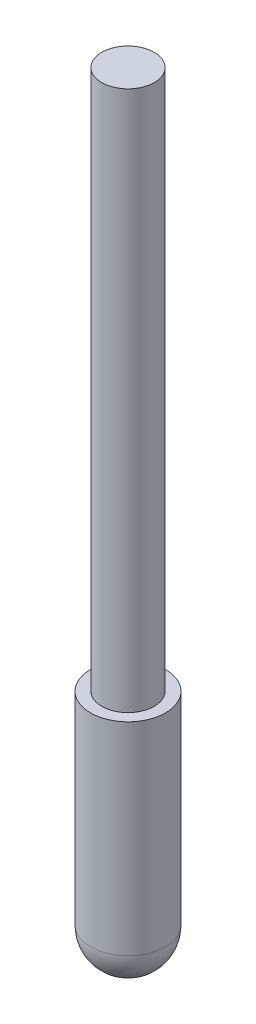
ISO-10303-21;
HEADER;
FILE_DESCRIPTION(('STEP AP214'),'2;1');
FILE_NAME('part.step','',(''),(''),'','','');
FILE_SCHEMA(('AUTOMOTIVE_DESIGN { 1 0 10303 214 1 1 1 1 }'));
ENDSEC;
DATA;
#1=APPLICATION_CONTEXT('core data for automotive mechanical design processes');
#2=APPLICATION_PROTOCOL_DEFINITION('international standard','automotive_design',2000,#1);
#3=PRODUCT_CONTEXT('',#1,'mechanical');
#4=PRODUCT('Part','Part','',(#3));
#5=PRODUCT_RELATED_PRODUCT_CATEGORY('part','',(#4));
#6=PRODUCT_DEFINITION_FORMATION('','',#4);
#7=PRODUCT_DEFINITION_CONTEXT('part definition',#1,'design');
#8=PRODUCT_DEFINITION('design','',#6,#7);
#9=PRODUCT_DEFINITION_SHAPE('','',#8);
#10=(LENGTH_UNIT() NAMED_UNIT(*) SI_UNIT(.MILLI.,.METRE.));
#11=(NAMED_UNIT(*) PLANE_ANGLE_UNIT() SI_UNIT($,.RADIAN.));
#12=(NAMED_UNIT(*) SI_UNIT($,.STERADIAN.) SOLID_ANGLE_UNIT());
#13=UNCERTAINTY_MEASURE_WITH_UNIT(LENGTH_MEASURE(1.E-05),#10,'distance_accuracy_value','');
#14=(GEOMETRIC_REPRESENTATION_CONTEXT(3) GLOBAL_UNCERTAINTY_ASSIGNED_CONTEXT((#13)) GLOBAL_UNIT_ASSIGNED_CONTEXT((#10,
#11,#12)) REPRESENTATION_CONTEXT('',''));
#15=CARTESIAN_POINT('',(0.,0.,0.));
#16=DIRECTION('',(0.,0.,1.));
#17=DIRECTION('',(1.,0.,0.));
#18=AXIS2_PLACEMENT_3D('',#15,#16,#17);
#19=CARTESIAN_POINT('',(0.,36.,0.));
#20=DIRECTION('',(0.,-1.,0.));
#21=DIRECTION('',(0.,0.,-1.));
#22=AXIS2_PLACEMENT_3D('',#19,#20,#21);
#23=CYLINDRICAL_SURFACE('',#22,1.75);
#24=CARTESIAN_POINT('',(0.,36.,0.));
#25=DIRECTION('',(0.,1.,0.));
#26=DIRECTION('',(0.,0.,1.));
#27=AXIS2_PLACEMENT_3D('',#24,#25,#26);
#28=CIRCLE('',#27,1.75);
#29=CARTESIAN_POINT('',(0.,36.,1.75));
#30=VERTEX_POINT('',#29);
#31=EDGE_CURVE('E45',#30,#30,#28,.T.);
#32=ORIENTED_EDGE('',*,*,#31,.F.);
#33=EDGE_LOOP('',(#32));
#34=FACE_BOUND('',#33,.T.);
#35=CARTESIAN_POINT('',(0.,0.,0.));
#36=DIRECTION('',(0.,1.,0.));
#37=DIRECTION('',(0.,0.,1.));
#38=AXIS2_PLACEMENT_3D('',#35,#36,#37);
#39=CIRCLE('',#38,1.75);
#40=CARTESIAN_POINT('',(0.,0.,1.75));
#41=VERTEX_POINT('',#40);
#42=EDGE_CURVE('E50',#41,#41,#39,.T.);
#43=ORIENTED_EDGE('',*,*,#42,.T.);
#44=EDGE_LOOP('',(#43));
#45=FACE_BOUND('',#44,.T.);
#46=ADVANCED_FACE('F37',(#34,#45),#23,.T.);
#47=CARTESIAN_POINT('',(0.,36.,0.));
#48=DIRECTION('',(0.,1.,0.));
#49=DIRECTION('',(0.,0.,1.));
#50=AXIS2_PLACEMENT_3D('',#47,#48,#49);
#51=PLANE('',#50);
#52=ORIENTED_EDGE('',*,*,#31,.T.);
#53=EDGE_LOOP('',(#52));
#54=FACE_BOUND('',#53,.T.);
#55=ADVANCED_FACE('F73',(#54),#51,.T.);
#56=CARTESIAN_POINT('',(0.,-16.,0.));
#57=DIRECTION('',(0.,1.,0.));
#58=DIRECTION('',(0.,0.,1.));
#59=AXIS2_PLACEMENT_3D('',#56,#57,#58);
#60=CYLINDRICAL_SURFACE('',#59,2.5);
#61=CARTESIAN_POINT('',(0.,-13.5,0.));
#62=DIRECTION('',(0.,1.,0.));
#63=DIRECTION('',(0.,0.,1.));
#64=AXIS2_PLACEMENT_3D('',#61,#62,#63);
#65=CIRCLE('',#64,2.5);
#66=CARTESIAN_POINT('',(0.,-13.5,2.5));
#67=VERTEX_POINT('',#66);
#68=EDGE_CURVE('E10',#67,#67,#65,.T.);
#69=ORIENTED_EDGE('',*,*,#68,.T.);
#70=EDGE_LOOP('',(#69));
#71=FACE_BOUND('',#70,.T.);
#72=CARTESIAN_POINT('',(0.,0.,0.));
#73=DIRECTION('',(0.,-1.,0.));
#74=DIRECTION('',(0.,0.,-1.));
#75=AXIS2_PLACEMENT_3D('',#72,#73,#74);
#76=CIRCLE('',#75,2.5);
#77=CARTESIAN_POINT('',(0.,0.,-2.5));
#78=VERTEX_POINT('',#77);
#79=EDGE_CURVE('E56',#78,#78,#76,.T.);
#80=ORIENTED_EDGE('',*,*,#79,.T.);
#81=EDGE_LOOP('',(#80));
#82=FACE_BOUND('',#81,.T.);
#83=ADVANCED_FACE('F62',(#71,#82),#60,.T.);
#84=CARTESIAN_POINT('',(0.,0.,0.));
#85=DIRECTION('',(0.,-1.,0.));
#86=DIRECTION('',(0.,0.,-1.));
#87=AXIS2_PLACEMENT_3D('',#84,#85,#86);
#88=PLANE('',#87);
#89=ORIENTED_EDGE('',*,*,#42,.F.);
#90=EDGE_LOOP('',(#89));
#91=FACE_BOUND('',#90,.T.);
#92=ORIENTED_EDGE('',*,*,#79,.F.);
#93=EDGE_LOOP('',(#92));
#94=FACE_BOUND('',#93,.T.);
#95=ADVANCED_FACE('F64',(#91,#94),#88,.F.);
#96=CARTESIAN_POINT('',(0.,-13.5,0.));
#97=DIRECTION('',(0.,-1.,0.));
#98=DIRECTION('',(0.,0.,-1.));
#99=AXIS2_PLACEMENT_3D('',#96,#97,#98);
#100=SPHERICAL_SURFACE('',#99,2.5);
#101=ORIENTED_EDGE('',*,*,#68,.F.);
#102=EDGE_LOOP('',(#101));
#103=FACE_BOUND('',#102,.T.);
#104=ADVANCED_FACE('F39',(#103),#100,.T.);
#105=CLOSED_SHELL('',(#46,#55,#83,#95,#104));
#106=MANIFOLD_SOLID_BREP('B2',#105);
#107=ADVANCED_BREP_SHAPE_REPRESENTATION('',(#18,#106),#14);
#108=SHAPE_DEFINITION_REPRESENTATION(#9,#107);
ENDSEC;
END-ISO-10303-21;
